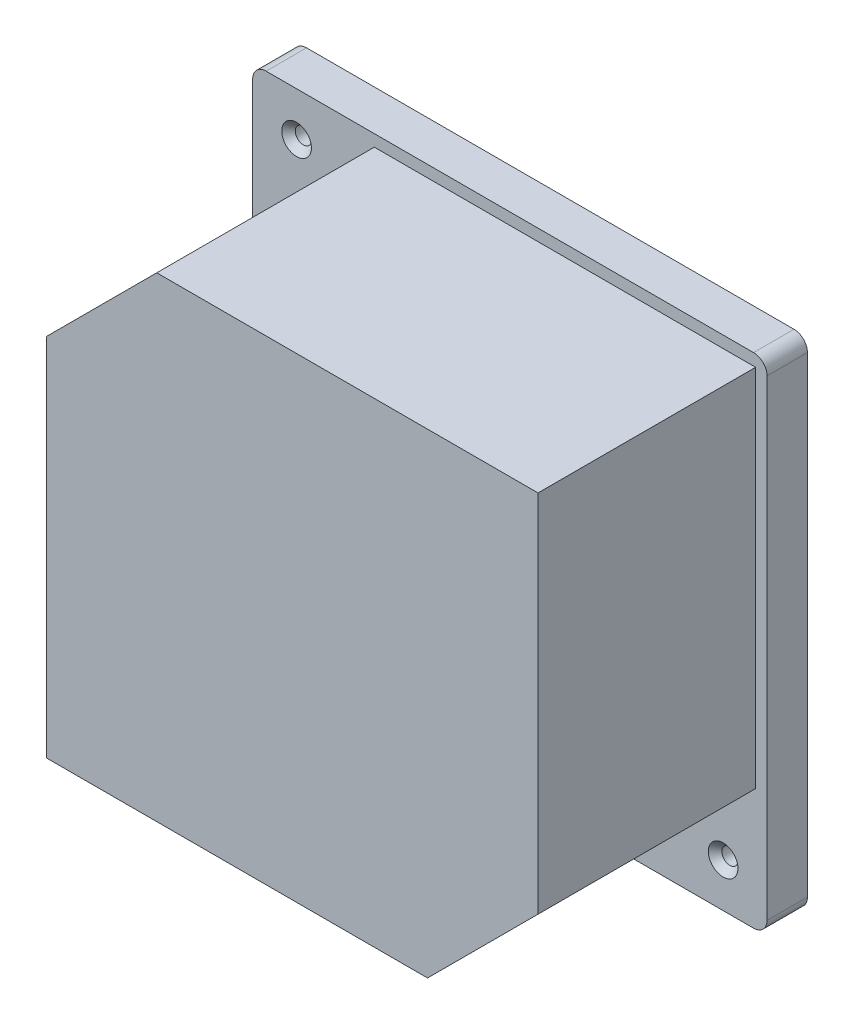
ISO-10303-21;
HEADER;
FILE_DESCRIPTION(('STEP AP214'),'2;1');
FILE_NAME('part.step','',(''),(''),'','','');
FILE_SCHEMA(('AUTOMOTIVE_DESIGN { 1 0 10303 214 1 1 1 1 }'));
ENDSEC;
DATA;
#1=APPLICATION_CONTEXT('core data for automotive mechanical design processes');
#2=APPLICATION_PROTOCOL_DEFINITION('international standard','automotive_design',2000,#1);
#3=PRODUCT_CONTEXT('',#1,'mechanical');
#4=PRODUCT('Part','Part','',(#3));
#5=PRODUCT_RELATED_PRODUCT_CATEGORY('part','',(#4));
#6=PRODUCT_DEFINITION_FORMATION('','',#4);
#7=PRODUCT_DEFINITION_CONTEXT('part definition',#1,'design');
#8=PRODUCT_DEFINITION('design','',#6,#7);
#9=PRODUCT_DEFINITION_SHAPE('','',#8);
#10=(LENGTH_UNIT() NAMED_UNIT(*) SI_UNIT(.MILLI.,.METRE.));
#11=(NAMED_UNIT(*) PLANE_ANGLE_UNIT() SI_UNIT($,.RADIAN.));
#12=(NAMED_UNIT(*) SI_UNIT($,.STERADIAN.) SOLID_ANGLE_UNIT());
#13=UNCERTAINTY_MEASURE_WITH_UNIT(LENGTH_MEASURE(1.E-05),#10,'distance_accuracy_value','');
#14=(GEOMETRIC_REPRESENTATION_CONTEXT(3) GLOBAL_UNCERTAINTY_ASSIGNED_CONTEXT((#13)) GLOBAL_UNIT_ASSIGNED_CONTEXT((#10,
#11,#12)) REPRESENTATION_CONTEXT('',''));
#15=CARTESIAN_POINT('',(0.,0.,0.));
#16=DIRECTION('',(0.,0.,1.));
#17=DIRECTION('',(1.,0.,0.));
#18=AXIS2_PLACEMENT_3D('',#15,#16,#17);
#19=CARTESIAN_POINT('',(43.7732437070171,29.4132437070172,6.));
#20=DIRECTION('',(0.,-1.,0.));
#21=DIRECTION('',(1.,0.,0.));
#22=AXIS2_PLACEMENT_3D('',#19,#20,#21);
#23=PLANE('',#22);
#24=DIRECTION('',(-1.,0.,0.));
#25=VECTOR('',#24,1.);
#26=CARTESIAN_POINT('',(43.7732437070171,29.4132437070172,6.));
#27=LINE('',#26,#25);
#28=CARTESIAN_POINT('',(41.7732437070171,29.4132437070172,6.));
#29=VERTEX_POINT('',#28);
#30=CARTESIAN_POINT('',(-30.5867562929829,29.4132437070172,6.));
#31=VERTEX_POINT('',#30);
#32=EDGE_CURVE('E351',#29,#31,#27,.T.);
#33=ORIENTED_EDGE('',*,*,#32,.F.);
#34=DIRECTION('',(0.,0.,-1.));
#35=VECTOR('',#34,1.);
#36=CARTESIAN_POINT('',(41.7732437070171,29.4132437070172,6.));
#37=LINE('',#36,#35);
#38=CARTESIAN_POINT('',(41.7732437070171,29.4132437070172,0.));
#39=VERTEX_POINT('',#38);
#40=EDGE_CURVE('E381',#29,#39,#37,.T.);
#41=ORIENTED_EDGE('',*,*,#40,.T.);
#42=DIRECTION('',(-1.,0.,0.));
#43=VECTOR('',#42,1.);
#44=CARTESIAN_POINT('',(43.7732437070171,29.4132437070172,0.));
#45=LINE('',#44,#43);
#46=CARTESIAN_POINT('',(-30.5867562929829,29.4132437070172,0.));
#47=VERTEX_POINT('',#46);
#48=EDGE_CURVE('E350',#39,#47,#45,.T.);
#49=ORIENTED_EDGE('',*,*,#48,.T.);
#50=DIRECTION('',(0.,0.,-1.));
#51=VECTOR('',#50,1.);
#52=CARTESIAN_POINT('',(-30.5867562929829,29.4132437070172,6.));
#53=LINE('',#52,#51);
#54=EDGE_CURVE('E376',#47,#31,#53,.F.);
#55=ORIENTED_EDGE('',*,*,#54,.T.);
#56=EDGE_LOOP('',(#33,#41,#49,#55));
#57=FACE_BOUND('',#56,.T.);
#58=ADVANCED_FACE('F43',(#57),#23,.F.);
#59=CARTESIAN_POINT('',(-32.5867562929829,29.4132437070172,6.));
#60=DIRECTION('',(1.,0.,0.));
#61=DIRECTION('',(0.,1.,0.));
#62=AXIS2_PLACEMENT_3D('',#59,#60,#61);
#63=PLANE('',#62);
#64=DIRECTION('',(0.,-1.,0.));
#65=VECTOR('',#64,1.);
#66=CARTESIAN_POINT('',(-32.5867562929829,29.4132437070172,0.));
#67=LINE('',#66,#65);
#68=CARTESIAN_POINT('',(-32.5867562929829,27.4132437070172,0.));
#69=VERTEX_POINT('',#68);
#70=CARTESIAN_POINT('',(-32.5867562929829,-42.5867562929828,0.));
#71=VERTEX_POINT('',#70);
#72=EDGE_CURVE('E364',#69,#71,#67,.T.);
#73=ORIENTED_EDGE('',*,*,#72,.T.);
#74=DIRECTION('',(0.,0.,-1.));
#75=VECTOR('',#74,1.);
#76=CARTESIAN_POINT('',(-32.5867562929829,-42.5867562929828,6.));
#77=LINE('',#76,#75);
#78=CARTESIAN_POINT('',(-32.5867562929829,-42.5867562929828,6.));
#79=VERTEX_POINT('',#78);
#80=EDGE_CURVE('E397',#71,#79,#77,.F.);
#81=ORIENTED_EDGE('',*,*,#80,.T.);
#82=DIRECTION('',(0.,-1.,0.));
#83=VECTOR('',#82,1.);
#84=CARTESIAN_POINT('',(-32.5867562929829,29.4132437070172,6.));
#85=LINE('',#84,#83);
#86=CARTESIAN_POINT('',(-32.5867562929829,27.4132437070172,6.));
#87=VERTEX_POINT('',#86);
#88=EDGE_CURVE('E353',#87,#79,#85,.T.);
#89=ORIENTED_EDGE('',*,*,#88,.F.);
#90=DIRECTION('',(0.,0.,-1.));
#91=VECTOR('',#90,1.);
#92=CARTESIAN_POINT('',(-32.5867562929829,27.4132437070172,6.));
#93=LINE('',#92,#91);
#94=EDGE_CURVE('E362',#87,#69,#93,.T.);
#95=ORIENTED_EDGE('',*,*,#94,.T.);
#96=EDGE_LOOP('',(#73,#81,#89,#95));
#97=FACE_BOUND('',#96,.T.);
#98=ADVANCED_FACE('F432',(#97),#63,.F.);
#99=CARTESIAN_POINT('',(-32.5867562929829,-44.5867562929828,6.));
#100=DIRECTION('',(0.,1.,0.));
#101=DIRECTION('',(0.,0.,1.));
#102=AXIS2_PLACEMENT_3D('',#99,#100,#101);
#103=PLANE('',#102);
#104=DIRECTION('',(1.,0.,0.));
#105=VECTOR('',#104,1.);
#106=CARTESIAN_POINT('',(-32.5867562929829,-44.5867562929828,0.));
#107=LINE('',#106,#105);
#108=CARTESIAN_POINT('',(-30.5867562929829,-44.5867562929828,0.));
#109=VERTEX_POINT('',#108);
#110=CARTESIAN_POINT('',(41.7732437070171,-44.5867562929828,0.));
#111=VERTEX_POINT('',#110);
#112=EDGE_CURVE('E367',#109,#111,#107,.T.);
#113=ORIENTED_EDGE('',*,*,#112,.T.);
#114=DIRECTION('',(0.,0.,-1.));
#115=VECTOR('',#114,1.);
#116=CARTESIAN_POINT('',(41.7732437070171,-44.5867562929828,6.));
#117=LINE('',#116,#115);
#118=CARTESIAN_POINT('',(41.7732437070171,-44.5867562929828,6.));
#119=VERTEX_POINT('',#118);
#120=EDGE_CURVE('E406',#111,#119,#117,.F.);
#121=ORIENTED_EDGE('',*,*,#120,.T.);
#122=DIRECTION('',(1.,0.,0.));
#123=VECTOR('',#122,1.);
#124=CARTESIAN_POINT('',(-32.5867562929829,-44.5867562929828,6.));
#125=LINE('',#124,#123);
#126=CARTESIAN_POINT('',(-30.5867562929829,-44.5867562929828,6.));
#127=VERTEX_POINT('',#126);
#128=EDGE_CURVE('E357',#127,#119,#125,.T.);
#129=ORIENTED_EDGE('',*,*,#128,.F.);
#130=DIRECTION('',(0.,0.,-1.));
#131=VECTOR('',#130,1.);
#132=CARTESIAN_POINT('',(-30.5867562929829,-44.5867562929828,6.));
#133=LINE('',#132,#131);
#134=EDGE_CURVE('E392',#127,#109,#133,.T.);
#135=ORIENTED_EDGE('',*,*,#134,.T.);
#136=EDGE_LOOP('',(#113,#121,#129,#135));
#137=FACE_BOUND('',#136,.T.);
#138=ADVANCED_FACE('F438',(#137),#103,.F.);
#139=CARTESIAN_POINT('',(43.7732437070171,-44.5867562929828,6.));
#140=DIRECTION('',(-1.,0.,0.));
#141=DIRECTION('',(0.,-1.,0.));
#142=AXIS2_PLACEMENT_3D('',#139,#140,#141);
#143=PLANE('',#142);
#144=DIRECTION('',(0.,1.,0.));
#145=VECTOR('',#144,1.);
#146=CARTESIAN_POINT('',(43.7732437070171,-44.5867562929828,6.));
#147=LINE('',#146,#145);
#148=CARTESIAN_POINT('',(43.7732437070171,-42.5867562929828,6.));
#149=VERTEX_POINT('',#148);
#150=CARTESIAN_POINT('',(43.7732437070171,27.4132437070172,6.));
#151=VERTEX_POINT('',#150);
#152=EDGE_CURVE('E360',#149,#151,#147,.T.);
#153=ORIENTED_EDGE('',*,*,#152,.F.);
#154=DIRECTION('',(0.,0.,-1.));
#155=VECTOR('',#154,1.);
#156=CARTESIAN_POINT('',(43.7732437070171,-42.5867562929828,6.));
#157=LINE('',#156,#155);
#158=CARTESIAN_POINT('',(43.7732437070171,-42.5867562929828,0.));
#159=VERTEX_POINT('',#158);
#160=EDGE_CURVE('E401',#149,#159,#157,.T.);
#161=ORIENTED_EDGE('',*,*,#160,.T.);
#162=DIRECTION('',(0.,1.,0.));
#163=VECTOR('',#162,1.);
#164=CARTESIAN_POINT('',(43.7732437070171,-44.5867562929828,0.));
#165=LINE('',#164,#163);
#166=CARTESIAN_POINT('',(43.7732437070171,27.4132437070172,0.));
#167=VERTEX_POINT('',#166);
#168=EDGE_CURVE('E354',#159,#167,#165,.T.);
#169=ORIENTED_EDGE('',*,*,#168,.T.);
#170=DIRECTION('',(0.,0.,-1.));
#171=VECTOR('',#170,1.);
#172=CARTESIAN_POINT('',(43.7732437070171,27.4132437070172,6.));
#173=LINE('',#172,#171);
#174=EDGE_CURVE('E387',#167,#151,#173,.F.);
#175=ORIENTED_EDGE('',*,*,#174,.T.);
#176=EDGE_LOOP('',(#153,#161,#169,#175));
#177=FACE_BOUND('',#176,.T.);
#178=ADVANCED_FACE('F474',(#177),#143,.F.);
#179=CARTESIAN_POINT('',(0.,0.,6.));
#180=DIRECTION('',(0.,0.,1.));
#181=DIRECTION('',(1.,0.,0.));
#182=AXIS2_PLACEMENT_3D('',#179,#180,#181);
#183=PLANE('',#182);
#184=DIRECTION('',(-0.707106781186548,-0.707106781186548,0.));
#185=VECTOR('',#184,1.);
#186=CARTESIAN_POINT('',(-21.1000000000001,21.1000000000001,6.));
#187=LINE('',#186,#185);
#188=CARTESIAN_POINT('',(-14.5267562929829,27.6732437070172,6.));
#189=VERTEX_POINT('',#188);
#190=CARTESIAN_POINT('',(-30.8867562929829,11.3132437070172,6.));
#191=VERTEX_POINT('',#190);
#192=EDGE_CURVE('E329',#189,#191,#187,.T.);
#193=ORIENTED_EDGE('',*,*,#192,.F.);
#194=DIRECTION('',(-1.,0.,0.));
#195=VECTOR('',#194,1.);
#196=CARTESIAN_POINT('',(0.,27.6732437070172,6.));
#197=LINE('',#196,#195);
#198=CARTESIAN_POINT('',(42.0732437070171,27.6732437070172,6.));
#199=VERTEX_POINT('',#198);
#200=EDGE_CURVE('E315',#199,#189,#197,.T.);
#201=ORIENTED_EDGE('',*,*,#200,.F.);
#202=DIRECTION('',(0.,1.,0.));
#203=VECTOR('',#202,1.);
#204=CARTESIAN_POINT('',(42.0732437070171,0.,6.));
#205=LINE('',#204,#203);
#206=CARTESIAN_POINT('',(42.0732437070171,-26.4889285983595,6.));
#207=VERTEX_POINT('',#206);
#208=EDGE_CURVE('E318',#207,#199,#205,.T.);
#209=ORIENTED_EDGE('',*,*,#208,.F.);
#210=DIRECTION('',(0.707106781186546,0.707106781186549,0.));
#211=VECTOR('',#210,1.);
#212=CARTESIAN_POINT('',(34.2810861526884,-34.2810861526883,6.));
#213=LINE('',#212,#211);
#214=CARTESIAN_POINT('',(25.6754160123939,-42.8867562929828,6.));
#215=VERTEX_POINT('',#214);
#216=EDGE_CURVE('E321',#215,#207,#213,.T.);
#217=ORIENTED_EDGE('',*,*,#216,.F.);
#218=DIRECTION('',(1.,0.,0.));
#219=VECTOR('',#218,1.);
#220=CARTESIAN_POINT('',(0.,-42.8867562929828,6.));
#221=LINE('',#220,#219);
#222=CARTESIAN_POINT('',(-30.8867562929829,-42.8867562929828,6.));
#223=VERTEX_POINT('',#222);
#224=EDGE_CURVE('E324',#223,#215,#221,.T.);
#225=ORIENTED_EDGE('',*,*,#224,.F.);
#226=DIRECTION('',(0.,1.,0.));
#227=VECTOR('',#226,1.);
#228=CARTESIAN_POINT('',(-30.8867562929829,0.,6.));
#229=LINE('',#228,#227);
#230=EDGE_CURVE('E327',#223,#191,#229,.T.);
#231=ORIENTED_EDGE('',*,*,#230,.T.);
#232=EDGE_LOOP('',(#193,#201,#209,#217,#225,#231));
#233=FACE_BOUND('',#232,.T.);
#234=CARTESIAN_POINT('',(-26.0666971211263,22.8932437070172,6.));
#235=DIRECTION('',(0.,0.,1.));
#236=DIRECTION('',(1.,0.,0.));
#237=AXIS2_PLACEMENT_3D('',#234,#235,#236);
#238=CIRCLE('',#237,2.2);
#239=CARTESIAN_POINT('',(-23.8666971211263,22.8932437070172,6.));
#240=VERTEX_POINT('',#239);
#241=EDGE_CURVE('E332',#240,#240,#238,.T.);
#242=ORIENTED_EDGE('',*,*,#241,.F.);
#243=EDGE_LOOP('',(#242));
#244=FACE_BOUND('',#243,.T.);
#245=CARTESIAN_POINT('',(37.2554160123939,-38.0666971211262,6.));
#246=DIRECTION('',(0.,0.,1.));
#247=DIRECTION('',(1.,0.,0.));
#248=AXIS2_PLACEMENT_3D('',#245,#246,#247);
#249=CIRCLE('',#248,2.2);
#250=CARTESIAN_POINT('',(39.4554160123939,-38.0666971211262,6.));
#251=VERTEX_POINT('',#250);
#252=EDGE_CURVE('E341',#251,#251,#249,.T.);
#253=ORIENTED_EDGE('',*,*,#252,.F.);
#254=EDGE_LOOP('',(#253));
#255=FACE_BOUND('',#254,.T.);
#256=ORIENTED_EDGE('',*,*,#128,.T.);
#257=CARTESIAN_POINT('',(41.7732437070171,-42.5867562929828,6.));
#258=DIRECTION('',(0.,0.,1.));
#259=DIRECTION('',(1.,0.,0.));
#260=AXIS2_PLACEMENT_3D('',#257,#258,#259);
#261=CIRCLE('',#260,2.);
#262=EDGE_CURVE('E408',#119,#149,#261,.T.);
#263=ORIENTED_EDGE('',*,*,#262,.T.);
#264=ORIENTED_EDGE('',*,*,#152,.T.);
#265=CARTESIAN_POINT('',(41.7732437070171,27.4132437070172,6.));
#266=DIRECTION('',(0.,0.,1.));
#267=DIRECTION('',(1.,0.,0.));
#268=AXIS2_PLACEMENT_3D('',#265,#266,#267);
#269=CIRCLE('',#268,2.);
#270=EDGE_CURVE('E390',#151,#29,#269,.T.);
#271=ORIENTED_EDGE('',*,*,#270,.T.);
#272=ORIENTED_EDGE('',*,*,#32,.T.);
#273=CARTESIAN_POINT('',(-30.5867562929829,27.4132437070172,6.));
#274=DIRECTION('',(0.,0.,1.));
#275=DIRECTION('',(1.,0.,0.));
#276=AXIS2_PLACEMENT_3D('',#273,#274,#275);
#277=CIRCLE('',#276,2.);
#278=EDGE_CURVE('E379',#31,#87,#277,.T.);
#279=ORIENTED_EDGE('',*,*,#278,.T.);
#280=ORIENTED_EDGE('',*,*,#88,.T.);
#281=CARTESIAN_POINT('',(-30.5867562929829,-42.5867562929828,6.));
#282=DIRECTION('',(0.,0.,1.));
#283=DIRECTION('',(1.,0.,0.));
#284=AXIS2_PLACEMENT_3D('',#281,#282,#283);
#285=CIRCLE('',#284,2.);
#286=EDGE_CURVE('E399',#79,#127,#285,.T.);
#287=ORIENTED_EDGE('',*,*,#286,.T.);
#288=EDGE_LOOP('',(#256,#263,#264,#271,#272,#279,#280,#287));
#289=FACE_BOUND('',#288,.T.);
#290=ADVANCED_FACE('F465',(#233,#244,#255,#289),#183,.T.);
#291=CARTESIAN_POINT('',(0.,0.,0.));
#292=DIRECTION('',(0.,0.,1.));
#293=DIRECTION('',(1.,0.,0.));
#294=AXIS2_PLACEMENT_3D('',#291,#292,#293);
#295=PLANE('',#294);
#296=DIRECTION('',(-1.,0.,0.));
#297=VECTOR('',#296,1.);
#298=CARTESIAN_POINT('',(25.1686050519443,-40.7867562929828,0.));
#299=LINE('',#298,#297);
#300=CARTESIAN_POINT('',(25.1686050519443,-40.7867562929828,0.));
#301=VERTEX_POINT('',#300);
#302=CARTESIAN_POINT('',(-28.7867562929829,-40.7867562929828,0.));
#303=VERTEX_POINT('',#302);
#304=EDGE_CURVE('E254',#301,#303,#299,.T.);
#305=ORIENTED_EDGE('',*,*,#304,.F.);
#306=DIRECTION('',(-0.710435525812495,-0.703762292015936,0.));
#307=VECTOR('',#306,1.);
#308=CARTESIAN_POINT('',(39.9754160123939,-26.119028060987,0.));
#309=LINE('',#308,#307);
#310=CARTESIAN_POINT('',(39.9754160123939,-26.119028060987,0.));
#311=VERTEX_POINT('',#310);
#312=EDGE_CURVE('E230',#311,#301,#309,.T.);
#313=ORIENTED_EDGE('',*,*,#312,.F.);
#314=DIRECTION('',(0.00355189987590054,-0.99999369198374,0.));
#315=VECTOR('',#314,1.);
#316=CARTESIAN_POINT('',(39.7916670036293,25.6132437070172,0.));
#317=LINE('',#316,#315);
#318=CARTESIAN_POINT('',(39.7916670036293,25.6132437070172,0.));
#319=VERTEX_POINT('',#318);
#320=EDGE_CURVE('E237',#319,#311,#317,.T.);
#321=ORIENTED_EDGE('',*,*,#320,.F.);
#322=DIRECTION('',(1.,0.,0.));
#323=VECTOR('',#322,1.);
#324=CARTESIAN_POINT('',(-13.3866503043968,25.6132437070172,0.));
#325=LINE('',#324,#323);
#326=CARTESIAN_POINT('',(-13.3866503043968,25.6132437070172,0.));
#327=VERTEX_POINT('',#326);
#328=EDGE_CURVE('E263',#327,#319,#325,.T.);
#329=ORIENTED_EDGE('',*,*,#328,.F.);
#330=DIRECTION('',(0.713531384787131,0.700623267472441,0.));
#331=VECTOR('',#330,1.);
#332=CARTESIAN_POINT('',(-28.7867562929829,10.4917328566374,0.));
#333=LINE('',#332,#331);
#334=CARTESIAN_POINT('',(-28.7867562929829,10.4917328566374,0.));
#335=VERTEX_POINT('',#334);
#336=EDGE_CURVE('E260',#335,#327,#333,.T.);
#337=ORIENTED_EDGE('',*,*,#336,.F.);
#338=DIRECTION('',(0.,1.,0.));
#339=VECTOR('',#338,1.);
#340=CARTESIAN_POINT('',(-28.7867562929829,-40.7867562929828,0.));
#341=LINE('',#340,#339);
#342=EDGE_CURVE('E257',#303,#335,#341,.T.);
#343=ORIENTED_EDGE('',*,*,#342,.F.);
#344=EDGE_LOOP('',(#305,#313,#321,#329,#337,#343));
#345=FACE_BOUND('',#344,.T.);
#346=CARTESIAN_POINT('',(-26.0666971211263,22.8932437070172,0.));
#347=DIRECTION('',(0.,0.,1.));
#348=DIRECTION('',(1.,0.,0.));
#349=AXIS2_PLACEMENT_3D('',#346,#347,#348);
#350=CIRCLE('',#349,1.19999999999999);
#351=CARTESIAN_POINT('',(-24.8666971211263,22.8932437070172,0.));
#352=VERTEX_POINT('',#351);
#353=EDGE_CURVE('E338',#352,#352,#350,.T.);
#354=ORIENTED_EDGE('',*,*,#353,.T.);
#355=EDGE_LOOP('',(#354));
#356=FACE_BOUND('',#355,.T.);
#357=CARTESIAN_POINT('',(37.2554160123939,-38.0666971211262,0.));
#358=DIRECTION('',(0.,0.,1.));
#359=DIRECTION('',(1.,0.,0.));
#360=AXIS2_PLACEMENT_3D('',#357,#358,#359);
#361=CIRCLE('',#360,1.19999999999999);
#362=CARTESIAN_POINT('',(38.4554160123938,-38.0666971211262,0.));
#363=VERTEX_POINT('',#362);
#364=EDGE_CURVE('E347',#363,#363,#361,.T.);
#365=ORIENTED_EDGE('',*,*,#364,.T.);
#366=EDGE_LOOP('',(#365));
#367=FACE_BOUND('',#366,.T.);
#368=ORIENTED_EDGE('',*,*,#168,.F.);
#369=CARTESIAN_POINT('',(41.7732437070171,-42.5867562929828,0.));
#370=DIRECTION('',(0.,0.,1.));
#371=DIRECTION('',(1.,0.,0.));
#372=AXIS2_PLACEMENT_3D('',#369,#370,#371);
#373=CIRCLE('',#372,2.);
#374=EDGE_CURVE('E404',#159,#111,#373,.F.);
#375=ORIENTED_EDGE('',*,*,#374,.T.);
#376=ORIENTED_EDGE('',*,*,#112,.F.);
#377=CARTESIAN_POINT('',(-30.5867562929829,-42.5867562929828,0.));
#378=DIRECTION('',(0.,0.,1.));
#379=DIRECTION('',(1.,0.,0.));
#380=AXIS2_PLACEMENT_3D('',#377,#378,#379);
#381=CIRCLE('',#380,2.);
#382=EDGE_CURVE('E395',#109,#71,#381,.F.);
#383=ORIENTED_EDGE('',*,*,#382,.T.);
#384=ORIENTED_EDGE('',*,*,#72,.F.);
#385=CARTESIAN_POINT('',(-30.5867562929829,27.4132437070172,0.));
#386=DIRECTION('',(0.,0.,1.));
#387=DIRECTION('',(1.,0.,0.));
#388=AXIS2_PLACEMENT_3D('',#385,#386,#387);
#389=CIRCLE('',#388,2.);
#390=EDGE_CURVE('E373',#69,#47,#389,.F.);
#391=ORIENTED_EDGE('',*,*,#390,.T.);
#392=ORIENTED_EDGE('',*,*,#48,.F.);
#393=CARTESIAN_POINT('',(41.7732437070171,27.4132437070172,0.));
#394=DIRECTION('',(0.,0.,1.));
#395=DIRECTION('',(1.,0.,0.));
#396=AXIS2_PLACEMENT_3D('',#393,#394,#395);
#397=CIRCLE('',#396,2.);
#398=EDGE_CURVE('E384',#39,#167,#397,.F.);
#399=ORIENTED_EDGE('',*,*,#398,.T.);
#400=EDGE_LOOP('',(#368,#375,#376,#383,#384,#391,#392,#399));
#401=FACE_BOUND('',#400,.T.);
#402=ADVANCED_FACE('F448',(#345,#356,#367,#401),#295,.F.);
#403=CARTESIAN_POINT('',(-30.5867562929829,27.4132437070172,6.));
#404=DIRECTION('',(0.,0.,-1.));
#405=DIRECTION('',(-1.,0.,0.));
#406=AXIS2_PLACEMENT_3D('',#403,#404,#405);
#407=CYLINDRICAL_SURFACE('',#406,2.);
#408=ORIENTED_EDGE('',*,*,#278,.F.);
#409=ORIENTED_EDGE('',*,*,#54,.F.);
#410=ORIENTED_EDGE('',*,*,#390,.F.);
#411=ORIENTED_EDGE('',*,*,#94,.F.);
#412=EDGE_LOOP('',(#408,#409,#410,#411));
#413=FACE_BOUND('',#412,.T.);
#414=ADVANCED_FACE('F444',(#413),#407,.T.);
#415=CARTESIAN_POINT('',(41.7732437070171,27.4132437070172,6.));
#416=DIRECTION('',(0.,0.,-1.));
#417=DIRECTION('',(-1.,0.,0.));
#418=AXIS2_PLACEMENT_3D('',#415,#416,#417);
#419=CYLINDRICAL_SURFACE('',#418,2.);
#420=ORIENTED_EDGE('',*,*,#270,.F.);
#421=ORIENTED_EDGE('',*,*,#174,.F.);
#422=ORIENTED_EDGE('',*,*,#398,.F.);
#423=ORIENTED_EDGE('',*,*,#40,.F.);
#424=EDGE_LOOP('',(#420,#421,#422,#423));
#425=FACE_BOUND('',#424,.T.);
#426=ADVANCED_FACE('F447',(#425),#419,.T.);
#427=CARTESIAN_POINT('',(-30.5867562929829,-42.5867562929828,6.));
#428=DIRECTION('',(0.,0.,-1.));
#429=DIRECTION('',(-1.,0.,0.));
#430=AXIS2_PLACEMENT_3D('',#427,#428,#429);
#431=CYLINDRICAL_SURFACE('',#430,2.);
#432=ORIENTED_EDGE('',*,*,#286,.F.);
#433=ORIENTED_EDGE('',*,*,#80,.F.);
#434=ORIENTED_EDGE('',*,*,#382,.F.);
#435=ORIENTED_EDGE('',*,*,#134,.F.);
#436=EDGE_LOOP('',(#432,#433,#434,#435));
#437=FACE_BOUND('',#436,.T.);
#438=ADVANCED_FACE('F451',(#437),#431,.T.);
#439=CARTESIAN_POINT('',(41.7732437070171,-42.5867562929828,6.));
#440=DIRECTION('',(0.,0.,-1.));
#441=DIRECTION('',(-1.,0.,0.));
#442=AXIS2_PLACEMENT_3D('',#439,#440,#441);
#443=CYLINDRICAL_SURFACE('',#442,2.);
#444=ORIENTED_EDGE('',*,*,#262,.F.);
#445=ORIENTED_EDGE('',*,*,#120,.F.);
#446=ORIENTED_EDGE('',*,*,#374,.F.);
#447=ORIENTED_EDGE('',*,*,#160,.F.);
#448=EDGE_LOOP('',(#444,#445,#446,#447));
#449=FACE_BOUND('',#448,.T.);
#450=ADVANCED_FACE('F45',(#449),#443,.T.);
#451=CARTESIAN_POINT('',(37.2554160123939,-38.0666971211262,6.));
#452=DIRECTION('',(0.,0.,1.));
#453=DIRECTION('',(1.,0.,0.));
#454=AXIS2_PLACEMENT_3D('',#451,#452,#453);
#455=CYLINDRICAL_SURFACE('',#454,1.19999999999999);
#456=ORIENTED_EDGE('',*,*,#364,.F.);
#457=EDGE_LOOP('',(#456));
#458=FACE_BOUND('',#457,.T.);
#459=CARTESIAN_POINT('',(37.2554160123939,-38.0666971211262,5.));
#460=DIRECTION('',(0.,0.,1.));
#461=DIRECTION('',(1.,0.,0.));
#462=AXIS2_PLACEMENT_3D('',#459,#460,#461);
#463=CIRCLE('',#462,1.19999999999999);
#464=CARTESIAN_POINT('',(38.4554160123938,-38.0666971211262,5.));
#465=VERTEX_POINT('',#464);
#466=EDGE_CURVE('E344',#465,#465,#463,.T.);
#467=ORIENTED_EDGE('',*,*,#466,.T.);
#468=EDGE_LOOP('',(#467));
#469=FACE_BOUND('',#468,.T.);
#470=ADVANCED_FACE('F458',(#458,#469),#455,.F.);
#471=CARTESIAN_POINT('',(37.2554160123939,-38.0666971211262,6.));
#472=DIRECTION('',(0.,0.,1.));
#473=DIRECTION('',(1.,0.,0.));
#474=AXIS2_PLACEMENT_3D('',#471,#472,#473);
#475=CONICAL_SURFACE('',#474,2.2,0.785398163397454);
#476=ORIENTED_EDGE('',*,*,#466,.F.);
#477=EDGE_LOOP('',(#476));
#478=FACE_BOUND('',#477,.T.);
#479=ORIENTED_EDGE('',*,*,#252,.T.);
#480=EDGE_LOOP('',(#479));
#481=FACE_BOUND('',#480,.T.);
#482=ADVANCED_FACE('F737',(#478,#481),#475,.F.);
#483=CARTESIAN_POINT('',(-26.0666971211263,22.8932437070172,6.));
#484=DIRECTION('',(0.,0.,1.));
#485=DIRECTION('',(1.,0.,0.));
#486=AXIS2_PLACEMENT_3D('',#483,#484,#485);
#487=CYLINDRICAL_SURFACE('',#486,1.19999999999999);
#488=ORIENTED_EDGE('',*,*,#353,.F.);
#489=EDGE_LOOP('',(#488));
#490=FACE_BOUND('',#489,.T.);
#491=CARTESIAN_POINT('',(-26.0666971211263,22.8932437070172,5.));
#492=DIRECTION('',(0.,0.,1.));
#493=DIRECTION('',(1.,0.,0.));
#494=AXIS2_PLACEMENT_3D('',#491,#492,#493);
#495=CIRCLE('',#494,1.19999999999999);
#496=CARTESIAN_POINT('',(-24.8666971211263,22.8932437070172,5.));
#497=VERTEX_POINT('',#496);
#498=EDGE_CURVE('E335',#497,#497,#495,.T.);
#499=ORIENTED_EDGE('',*,*,#498,.T.);
#500=EDGE_LOOP('',(#499));
#501=FACE_BOUND('',#500,.T.);
#502=ADVANCED_FACE('F728',(#490,#501),#487,.F.);
#503=CARTESIAN_POINT('',(-26.0666971211263,22.8932437070172,6.));
#504=DIRECTION('',(0.,0.,1.));
#505=DIRECTION('',(1.,0.,0.));
#506=AXIS2_PLACEMENT_3D('',#503,#504,#505);
#507=CONICAL_SURFACE('',#506,2.2,0.785398163397454);
#508=ORIENTED_EDGE('',*,*,#498,.F.);
#509=EDGE_LOOP('',(#508));
#510=FACE_BOUND('',#509,.T.);
#511=ORIENTED_EDGE('',*,*,#241,.T.);
#512=EDGE_LOOP('',(#511));
#513=FACE_BOUND('',#512,.T.);
#514=ADVANCED_FACE('F520',(#510,#513),#507,.F.);
#515=CARTESIAN_POINT('',(-21.1000000000001,21.1000000000001,38.3));
#516=DIRECTION('',(-0.707106781186548,0.707106781186548,0.));
#517=DIRECTION('',(-0.707106781186548,-0.707106781186548,0.));
#518=AXIS2_PLACEMENT_3D('',#515,#516,#517);
#519=PLANE('',#518);
#520=DIRECTION('',(0.,0.,-1.));
#521=VECTOR('',#520,1.);
#522=CARTESIAN_POINT('',(-14.5267562929829,27.6732437070172,38.3));
#523=LINE('',#522,#521);
#524=CARTESIAN_POINT('',(-14.5267562929829,27.6732437070172,38.3));
#525=VERTEX_POINT('',#524);
#526=EDGE_CURVE('E297',#525,#189,#523,.T.);
#527=ORIENTED_EDGE('',*,*,#526,.T.);
#528=ORIENTED_EDGE('',*,*,#192,.T.);
#529=DIRECTION('',(0.,0.,-1.));
#530=VECTOR('',#529,1.);
#531=CARTESIAN_POINT('',(-30.8867562929829,11.3132437070172,38.3));
#532=LINE('',#531,#530);
#533=CARTESIAN_POINT('',(-30.8867562929829,11.3132437070172,38.3));
#534=VERTEX_POINT('',#533);
#535=EDGE_CURVE('E312',#534,#191,#532,.T.);
#536=ORIENTED_EDGE('',*,*,#535,.F.);
#537=DIRECTION('',(0.707106781186548,0.707106781186548,0.));
#538=VECTOR('',#537,1.);
#539=CARTESIAN_POINT('',(-21.1000000000001,21.1000000000001,38.3));
#540=LINE('',#539,#538);
#541=EDGE_CURVE('E270',#534,#525,#540,.T.);
#542=ORIENTED_EDGE('',*,*,#541,.T.);
#543=EDGE_LOOP('',(#527,#528,#536,#542));
#544=FACE_BOUND('',#543,.T.);
#545=ADVANCED_FACE('F525',(#544),#519,.T.);
#546=CARTESIAN_POINT('',(-30.8867562929829,0.,38.3));
#547=DIRECTION('',(1.,0.,0.));
#548=DIRECTION('',(0.,1.,0.));
#549=AXIS2_PLACEMENT_3D('',#546,#547,#548);
#550=PLANE('',#549);
#551=ORIENTED_EDGE('',*,*,#230,.F.);
#552=DIRECTION('',(0.,0.,-1.));
#553=VECTOR('',#552,1.);
#554=CARTESIAN_POINT('',(-30.8867562929829,-42.8867562929828,38.3));
#555=LINE('',#554,#553);
#556=CARTESIAN_POINT('',(-30.8867562929829,-42.8867562929828,38.3));
#557=VERTEX_POINT('',#556);
#558=EDGE_CURVE('E309',#557,#223,#555,.T.);
#559=ORIENTED_EDGE('',*,*,#558,.F.);
#560=DIRECTION('',(0.,-1.,0.));
#561=VECTOR('',#560,1.);
#562=CARTESIAN_POINT('',(-30.8867562929829,0.,38.3));
#563=LINE('',#562,#561);
#564=EDGE_CURVE('E283',#534,#557,#563,.T.);
#565=ORIENTED_EDGE('',*,*,#564,.F.);
#566=ORIENTED_EDGE('',*,*,#535,.T.);
#567=EDGE_LOOP('',(#551,#559,#565,#566));
#568=FACE_BOUND('',#567,.T.);
#569=ADVANCED_FACE('F530',(#568),#550,.F.);
#570=CARTESIAN_POINT('',(0.,-42.8867562929828,38.3));
#571=DIRECTION('',(0.,-1.,0.));
#572=DIRECTION('',(1.,0.,0.));
#573=AXIS2_PLACEMENT_3D('',#570,#571,#572);
#574=PLANE('',#573);
#575=DIRECTION('',(0.,0.,1.));
#576=VECTOR('',#575,1.);
#577=CARTESIAN_POINT('',(12.95,-42.8867562929828,32.8));
#578=LINE('',#577,#576);
#579=CARTESIAN_POINT('',(12.95,-42.8867562929828,11.2));
#580=VERTEX_POINT('',#579);
#581=CARTESIAN_POINT('',(12.95,-42.8867562929828,32.8));
#582=VERTEX_POINT('',#581);
#583=EDGE_CURVE('E58',#580,#582,#578,.T.);
#584=ORIENTED_EDGE('',*,*,#583,.F.);
#585=DIRECTION('',(1.,0.,0.));
#586=VECTOR('',#585,1.);
#587=CARTESIAN_POINT('',(-24.95,-42.8867562929828,11.2));
#588=LINE('',#587,#586);
#589=CARTESIAN_POINT('',(-24.95,-42.8867562929828,11.2));
#590=VERTEX_POINT('',#589);
#591=EDGE_CURVE('E223',#590,#580,#588,.T.);
#592=ORIENTED_EDGE('',*,*,#591,.F.);
#593=DIRECTION('',(0.,0.,-1.));
#594=VECTOR('',#593,1.);
#595=CARTESIAN_POINT('',(-24.95,-42.8867562929828,32.8));
#596=LINE('',#595,#594);
#597=CARTESIAN_POINT('',(-24.95,-42.8867562929828,32.8));
#598=VERTEX_POINT('',#597);
#599=EDGE_CURVE('E207',#598,#590,#596,.T.);
#600=ORIENTED_EDGE('',*,*,#599,.F.);
#601=DIRECTION('',(-1.,0.,0.));
#602=VECTOR('',#601,1.);
#603=CARTESIAN_POINT('',(-24.95,-42.8867562929828,32.8));
#604=LINE('',#603,#602);
#605=EDGE_CURVE('E216',#582,#598,#604,.T.);
#606=ORIENTED_EDGE('',*,*,#605,.F.);
#607=EDGE_LOOP('',(#584,#592,#600,#606));
#608=FACE_BOUND('',#607,.T.);
#609=ORIENTED_EDGE('',*,*,#558,.T.);
#610=ORIENTED_EDGE('',*,*,#224,.T.);
#611=DIRECTION('',(0.,0.,-1.));
#612=VECTOR('',#611,1.);
#613=CARTESIAN_POINT('',(25.6754160123939,-42.8867562929828,38.3));
#614=LINE('',#613,#612);
#615=CARTESIAN_POINT('',(25.6754160123939,-42.8867562929828,38.3));
#616=VERTEX_POINT('',#615);
#617=EDGE_CURVE('E306',#616,#215,#614,.T.);
#618=ORIENTED_EDGE('',*,*,#617,.F.);
#619=DIRECTION('',(-1.,0.,0.));
#620=VECTOR('',#619,1.);
#621=CARTESIAN_POINT('',(0.,-42.8867562929828,38.3));
#622=LINE('',#621,#620);
#623=EDGE_CURVE('E285',#616,#557,#622,.T.);
#624=ORIENTED_EDGE('',*,*,#623,.T.);
#625=EDGE_LOOP('',(#609,#610,#618,#624));
#626=FACE_BOUND('',#625,.T.);
#627=ADVANCED_FACE('F220',(#608,#626),#574,.T.);
#628=CARTESIAN_POINT('',(34.2810861526884,-34.2810861526883,38.3));
#629=DIRECTION('',(0.707106781186549,-0.707106781186546,0.));
#630=DIRECTION('',(0.707106781186546,0.707106781186549,0.));
#631=AXIS2_PLACEMENT_3D('',#628,#629,#630);
#632=PLANE('',#631);
#633=ORIENTED_EDGE('',*,*,#617,.T.);
#634=ORIENTED_EDGE('',*,*,#216,.T.);
#635=DIRECTION('',(0.,0.,-1.));
#636=VECTOR('',#635,1.);
#637=CARTESIAN_POINT('',(42.0732437070171,-26.4889285983595,38.3));
#638=LINE('',#637,#636);
#639=CARTESIAN_POINT('',(42.0732437070171,-26.4889285983595,38.3));
#640=VERTEX_POINT('',#639);
#641=EDGE_CURVE('E303',#640,#207,#638,.T.);
#642=ORIENTED_EDGE('',*,*,#641,.F.);
#643=DIRECTION('',(-0.707106781186546,-0.707106781186549,0.));
#644=VECTOR('',#643,1.);
#645=CARTESIAN_POINT('',(34.2810861526884,-34.2810861526883,38.3));
#646=LINE('',#645,#644);
#647=EDGE_CURVE('E288',#640,#616,#646,.T.);
#648=ORIENTED_EDGE('',*,*,#647,.T.);
#649=EDGE_LOOP('',(#633,#634,#642,#648));
#650=FACE_BOUND('',#649,.T.);
#651=ADVANCED_FACE('F549',(#650),#632,.T.);
#652=CARTESIAN_POINT('',(42.0732437070171,0.,38.3));
#653=DIRECTION('',(1.,0.,0.));
#654=DIRECTION('',(0.,0.,-1.));
#655=AXIS2_PLACEMENT_3D('',#652,#653,#654);
#656=PLANE('',#655);
#657=ORIENTED_EDGE('',*,*,#641,.T.);
#658=ORIENTED_EDGE('',*,*,#208,.T.);
#659=DIRECTION('',(0.,0.,-1.));
#660=VECTOR('',#659,1.);
#661=CARTESIAN_POINT('',(42.0732437070171,27.6732437070172,38.3));
#662=LINE('',#661,#660);
#663=CARTESIAN_POINT('',(42.0732437070171,27.6732437070172,38.3));
#664=VERTEX_POINT('',#663);
#665=EDGE_CURVE('E300',#664,#199,#662,.T.);
#666=ORIENTED_EDGE('',*,*,#665,.F.);
#667=DIRECTION('',(0.,-1.,0.));
#668=VECTOR('',#667,1.);
#669=CARTESIAN_POINT('',(42.0732437070171,0.,38.3));
#670=LINE('',#669,#668);
#671=EDGE_CURVE('E291',#664,#640,#670,.T.);
#672=ORIENTED_EDGE('',*,*,#671,.T.);
#673=EDGE_LOOP('',(#657,#658,#666,#672));
#674=FACE_BOUND('',#673,.T.);
#675=ADVANCED_FACE('F554',(#674),#656,.T.);
#676=CARTESIAN_POINT('',(0.,27.6732437070172,38.3));
#677=DIRECTION('',(0.,1.,0.));
#678=DIRECTION('',(0.,0.,1.));
#679=AXIS2_PLACEMENT_3D('',#676,#677,#678);
#680=PLANE('',#679);
#681=ORIENTED_EDGE('',*,*,#665,.T.);
#682=ORIENTED_EDGE('',*,*,#200,.T.);
#683=ORIENTED_EDGE('',*,*,#526,.F.);
#684=DIRECTION('',(1.,0.,0.));
#685=VECTOR('',#684,1.);
#686=CARTESIAN_POINT('',(0.,27.6732437070172,38.3));
#687=LINE('',#686,#685);
#688=EDGE_CURVE('E294',#525,#664,#687,.T.);
#689=ORIENTED_EDGE('',*,*,#688,.T.);
#690=EDGE_LOOP('',(#681,#682,#683,#689));
#691=FACE_BOUND('',#690,.T.);
#692=ADVANCED_FACE('F566',(#691),#680,.T.);
#693=CARTESIAN_POINT('',(0.,0.,38.3));
#694=DIRECTION('',(0.,0.,1.));
#695=DIRECTION('',(1.,0.,0.));
#696=AXIS2_PLACEMENT_3D('',#693,#694,#695);
#697=PLANE('',#696);
#698=ORIENTED_EDGE('',*,*,#541,.F.);
#699=ORIENTED_EDGE('',*,*,#564,.T.);
#700=ORIENTED_EDGE('',*,*,#623,.F.);
#701=ORIENTED_EDGE('',*,*,#647,.F.);
#702=ORIENTED_EDGE('',*,*,#671,.F.);
#703=ORIENTED_EDGE('',*,*,#688,.F.);
#704=EDGE_LOOP('',(#698,#699,#700,#701,#702,#703));
#705=FACE_BOUND('',#704,.T.);
#706=ADVANCED_FACE('F577',(#705),#697,.T.);
#707=CARTESIAN_POINT('',(39.9754160123939,-26.119028060987,36.3));
#708=DIRECTION('',(0.703762292015936,-0.710435525812495,0.));
#709=DIRECTION('',(0.710435525812495,0.703762292015937,0.));
#710=AXIS2_PLACEMENT_3D('',#707,#708,#709);
#711=PLANE('',#710);
#712=ORIENTED_EDGE('',*,*,#312,.T.);
#713=DIRECTION('',(0.,0.,-1.));
#714=VECTOR('',#713,1.);
#715=CARTESIAN_POINT('',(25.1686050519443,-40.7867562929828,36.3));
#716=LINE('',#715,#714);
#717=CARTESIAN_POINT('',(25.1686050519443,-40.7867562929828,36.3));
#718=VERTEX_POINT('',#717);
#719=EDGE_CURVE('E252',#718,#301,#716,.T.);
#720=ORIENTED_EDGE('',*,*,#719,.F.);
#721=DIRECTION('',(-0.710435525812495,-0.703762292015936,0.));
#722=VECTOR('',#721,1.);
#723=CARTESIAN_POINT('',(39.9754160123939,-26.119028060987,36.3));
#724=LINE('',#723,#722);
#725=CARTESIAN_POINT('',(39.9754160123939,-26.119028060987,36.3));
#726=VERTEX_POINT('',#725);
#727=EDGE_CURVE('E233',#726,#718,#724,.T.);
#728=ORIENTED_EDGE('',*,*,#727,.F.);
#729=DIRECTION('',(0.,0.,-1.));
#730=VECTOR('',#729,1.);
#731=CARTESIAN_POINT('',(39.9754160123939,-26.119028060987,36.3));
#732=LINE('',#731,#730);
#733=EDGE_CURVE('E268',#726,#311,#732,.T.);
#734=ORIENTED_EDGE('',*,*,#733,.T.);
#735=EDGE_LOOP('',(#712,#720,#728,#734));
#736=FACE_BOUND('',#735,.T.);
#737=ADVANCED_FACE('F587',(#736),#711,.F.);
#738=CARTESIAN_POINT('',(39.7916670036293,25.6132437070172,36.3));
#739=DIRECTION('',(0.99999369198374,0.00355189987590054,0.));
#740=DIRECTION('',(-0.00355189987590054,0.99999369198374,0.));
#741=AXIS2_PLACEMENT_3D('',#738,#739,#740);
#742=PLANE('',#741);
#743=ORIENTED_EDGE('',*,*,#320,.T.);
#744=ORIENTED_EDGE('',*,*,#733,.F.);
#745=DIRECTION('',(0.00355189987590054,-0.99999369198374,0.));
#746=VECTOR('',#745,1.);
#747=CARTESIAN_POINT('',(39.7916670036293,25.6132437070172,36.3));
#748=LINE('',#747,#746);
#749=CARTESIAN_POINT('',(39.7916670036293,25.6132437070172,36.3));
#750=VERTEX_POINT('',#749);
#751=EDGE_CURVE('E249',#750,#726,#748,.T.);
#752=ORIENTED_EDGE('',*,*,#751,.F.);
#753=DIRECTION('',(0.,0.,-1.));
#754=VECTOR('',#753,1.);
#755=CARTESIAN_POINT('',(39.7916670036293,25.6132437070172,36.3));
#756=LINE('',#755,#754);
#757=EDGE_CURVE('E271',#750,#319,#756,.T.);
#758=ORIENTED_EDGE('',*,*,#757,.T.);
#759=EDGE_LOOP('',(#743,#744,#752,#758));
#760=FACE_BOUND('',#759,.T.);
#761=ADVANCED_FACE('F604',(#760),#742,.F.);
#762=CARTESIAN_POINT('',(-13.3866503043968,25.6132437070172,36.3));
#763=DIRECTION('',(0.,1.,0.));
#764=DIRECTION('',(-1.,0.,0.));
#765=AXIS2_PLACEMENT_3D('',#762,#763,#764);
#766=PLANE('',#765);
#767=ORIENTED_EDGE('',*,*,#328,.T.);
#768=ORIENTED_EDGE('',*,*,#757,.F.);
#769=DIRECTION('',(1.,0.,0.));
#770=VECTOR('',#769,1.);
#771=CARTESIAN_POINT('',(-13.3866503043968,25.6132437070172,36.3));
#772=LINE('',#771,#770);
#773=CARTESIAN_POINT('',(-13.3866503043968,25.6132437070172,36.3));
#774=VERTEX_POINT('',#773);
#775=EDGE_CURVE('E246',#774,#750,#772,.T.);
#776=ORIENTED_EDGE('',*,*,#775,.F.);
#777=DIRECTION('',(0.,0.,-1.));
#778=VECTOR('',#777,1.);
#779=CARTESIAN_POINT('',(-13.3866503043968,25.6132437070172,36.3));
#780=LINE('',#779,#778);
#781=EDGE_CURVE('E273',#774,#327,#780,.T.);
#782=ORIENTED_EDGE('',*,*,#781,.T.);
#783=EDGE_LOOP('',(#767,#768,#776,#782));
#784=FACE_BOUND('',#783,.T.);
#785=ADVANCED_FACE('F615',(#784),#766,.F.);
#786=CARTESIAN_POINT('',(-28.7867562929829,10.4917328566374,36.3));
#787=DIRECTION('',(-0.700623267472441,0.713531384787131,0.));
#788=DIRECTION('',(-0.713531384787131,-0.700623267472441,0.));
#789=AXIS2_PLACEMENT_3D('',#786,#787,#788);
#790=PLANE('',#789);
#791=ORIENTED_EDGE('',*,*,#336,.T.);
#792=ORIENTED_EDGE('',*,*,#781,.F.);
#793=DIRECTION('',(0.713531384787131,0.700623267472441,0.));
#794=VECTOR('',#793,1.);
#795=CARTESIAN_POINT('',(-28.7867562929829,10.4917328566374,36.3));
#796=LINE('',#795,#794);
#797=CARTESIAN_POINT('',(-28.7867562929829,10.4917328566374,36.3));
#798=VERTEX_POINT('',#797);
#799=EDGE_CURVE('E243',#798,#774,#796,.T.);
#800=ORIENTED_EDGE('',*,*,#799,.F.);
#801=DIRECTION('',(0.,0.,-1.));
#802=VECTOR('',#801,1.);
#803=CARTESIAN_POINT('',(-28.7867562929829,10.4917328566374,36.3));
#804=LINE('',#803,#802);
#805=EDGE_CURVE('E275',#798,#335,#804,.T.);
#806=ORIENTED_EDGE('',*,*,#805,.T.);
#807=EDGE_LOOP('',(#791,#792,#800,#806));
#808=FACE_BOUND('',#807,.T.);
#809=ADVANCED_FACE('F626',(#808),#790,.F.);
#810=CARTESIAN_POINT('',(-28.7867562929829,-40.7867562929828,36.3));
#811=DIRECTION('',(-1.,0.,0.));
#812=DIRECTION('',(0.,0.,1.));
#813=AXIS2_PLACEMENT_3D('',#810,#811,#812);
#814=PLANE('',#813);
#815=ORIENTED_EDGE('',*,*,#342,.T.);
#816=ORIENTED_EDGE('',*,*,#805,.F.);
#817=DIRECTION('',(0.,1.,0.));
#818=VECTOR('',#817,1.);
#819=CARTESIAN_POINT('',(-28.7867562929829,-40.7867562929828,36.3));
#820=LINE('',#819,#818);
#821=CARTESIAN_POINT('',(-28.7867562929829,-40.7867562929828,36.3));
#822=VERTEX_POINT('',#821);
#823=EDGE_CURVE('E240',#822,#798,#820,.T.);
#824=ORIENTED_EDGE('',*,*,#823,.F.);
#825=DIRECTION('',(0.,0.,-1.));
#826=VECTOR('',#825,1.);
#827=CARTESIAN_POINT('',(-28.7867562929829,-40.7867562929828,36.3));
#828=LINE('',#827,#826);
#829=EDGE_CURVE('E277',#822,#303,#828,.T.);
#830=ORIENTED_EDGE('',*,*,#829,.T.);
#831=EDGE_LOOP('',(#815,#816,#824,#830));
#832=FACE_BOUND('',#831,.T.);
#833=ADVANCED_FACE('F637',(#832),#814,.F.);
#834=CARTESIAN_POINT('',(25.1686050519443,-40.7867562929828,36.3));
#835=DIRECTION('',(0.,-1.,0.));
#836=DIRECTION('',(0.,0.,-1.));
#837=AXIS2_PLACEMENT_3D('',#834,#835,#836);
#838=PLANE('',#837);
#839=DIRECTION('',(1.,0.,0.));
#840=VECTOR('',#839,1.);
#841=CARTESIAN_POINT('',(25.1686050519443,-40.7867562929828,11.2));
#842=LINE('',#841,#840);
#843=CARTESIAN_POINT('',(-24.95,-40.7867562929828,11.2));
#844=VERTEX_POINT('',#843);
#845=CARTESIAN_POINT('',(12.95,-40.7867562929828,11.2));
#846=VERTEX_POINT('',#845);
#847=EDGE_CURVE('E51',#844,#846,#842,.T.);
#848=ORIENTED_EDGE('',*,*,#847,.T.);
#849=DIRECTION('',(0.,0.,1.));
#850=VECTOR('',#849,1.);
#851=CARTESIAN_POINT('',(12.95,-40.7867562929828,36.3));
#852=LINE('',#851,#850);
#853=CARTESIAN_POINT('',(12.95,-40.7867562929828,32.8));
#854=VERTEX_POINT('',#853);
#855=EDGE_CURVE('E11',#846,#854,#852,.T.);
#856=ORIENTED_EDGE('',*,*,#855,.T.);
#857=DIRECTION('',(-1.,0.,0.));
#858=VECTOR('',#857,1.);
#859=CARTESIAN_POINT('',(25.1686050519443,-40.7867562929828,32.8));
#860=LINE('',#859,#858);
#861=CARTESIAN_POINT('',(-24.95,-40.7867562929828,32.8));
#862=VERTEX_POINT('',#861);
#863=EDGE_CURVE('E410',#854,#862,#860,.T.);
#864=ORIENTED_EDGE('',*,*,#863,.T.);
#865=DIRECTION('',(0.,0.,-1.));
#866=VECTOR('',#865,1.);
#867=CARTESIAN_POINT('',(-24.95,-40.7867562929828,36.3));
#868=LINE('',#867,#866);
#869=EDGE_CURVE('E210',#862,#844,#868,.T.);
#870=ORIENTED_EDGE('',*,*,#869,.T.);
#871=EDGE_LOOP('',(#848,#856,#864,#870));
#872=FACE_BOUND('',#871,.T.);
#873=ORIENTED_EDGE('',*,*,#304,.T.);
#874=ORIENTED_EDGE('',*,*,#829,.F.);
#875=DIRECTION('',(-1.,0.,0.));
#876=VECTOR('',#875,1.);
#877=CARTESIAN_POINT('',(25.1686050519443,-40.7867562929828,36.3));
#878=LINE('',#877,#876);
#879=EDGE_CURVE('E236',#718,#822,#878,.T.);
#880=ORIENTED_EDGE('',*,*,#879,.F.);
#881=ORIENTED_EDGE('',*,*,#719,.T.);
#882=EDGE_LOOP('',(#873,#874,#880,#881));
#883=FACE_BOUND('',#882,.T.);
#884=ADVANCED_FACE('F414',(#872,#883),#838,.F.);
#885=CARTESIAN_POINT('',(0.,0.,36.3));
#886=DIRECTION('',(0.,0.,1.));
#887=DIRECTION('',(1.,0.,0.));
#888=AXIS2_PLACEMENT_3D('',#885,#886,#887);
#889=PLANE('',#888);
#890=ORIENTED_EDGE('',*,*,#727,.T.);
#891=ORIENTED_EDGE('',*,*,#879,.T.);
#892=ORIENTED_EDGE('',*,*,#823,.T.);
#893=ORIENTED_EDGE('',*,*,#799,.T.);
#894=ORIENTED_EDGE('',*,*,#775,.T.);
#895=ORIENTED_EDGE('',*,*,#751,.T.);
#896=EDGE_LOOP('',(#890,#891,#892,#893,#894,#895));
#897=FACE_BOUND('',#896,.T.);
#898=ADVANCED_FACE('F421',(#897),#889,.F.);
#899=CARTESIAN_POINT('',(12.95,-32.8867562929828,32.8));
#900=DIRECTION('',(1.,0.,0.));
#901=DIRECTION('',(0.,0.,-1.));
#902=AXIS2_PLACEMENT_3D('',#899,#900,#901);
#903=PLANE('',#902);
#904=DIRECTION('',(0.,-1.,0.));
#905=VECTOR('',#904,1.);
#906=CARTESIAN_POINT('',(12.95,-32.8867562929828,11.2));
#907=LINE('',#906,#905);
#908=EDGE_CURVE('E228',#846,#580,#907,.T.);
#909=ORIENTED_EDGE('',*,*,#908,.T.);
#910=ORIENTED_EDGE('',*,*,#583,.T.);
#911=DIRECTION('',(0.,-1.,0.));
#912=VECTOR('',#911,1.);
#913=CARTESIAN_POINT('',(12.95,-32.8867562929828,32.8));
#914=LINE('',#913,#912);
#915=EDGE_CURVE('E213',#854,#582,#914,.T.);
#916=ORIENTED_EDGE('',*,*,#915,.F.);
#917=ORIENTED_EDGE('',*,*,#855,.F.);
#918=EDGE_LOOP('',(#909,#910,#916,#917));
#919=FACE_BOUND('',#918,.T.);
#920=ADVANCED_FACE('F419',(#919),#903,.F.);
#921=CARTESIAN_POINT('',(-24.95,-32.8867562929828,11.2));
#922=DIRECTION('',(0.,0.,-1.));
#923=DIRECTION('',(-1.,0.,0.));
#924=AXIS2_PLACEMENT_3D('',#921,#922,#923);
#925=PLANE('',#924);
#926=DIRECTION('',(0.,-1.,0.));
#927=VECTOR('',#926,1.);
#928=CARTESIAN_POINT('',(-24.95,-32.8867562929828,11.2));
#929=LINE('',#928,#927);
#930=EDGE_CURVE('E212',#844,#590,#929,.T.);
#931=ORIENTED_EDGE('',*,*,#930,.T.);
#932=ORIENTED_EDGE('',*,*,#591,.T.);
#933=ORIENTED_EDGE('',*,*,#908,.F.);
#934=ORIENTED_EDGE('',*,*,#847,.F.);
#935=EDGE_LOOP('',(#931,#932,#933,#934));
#936=FACE_BOUND('',#935,.T.);
#937=ADVANCED_FACE('F418',(#936),#925,.F.);
#938=CARTESIAN_POINT('',(-24.95,-32.8867562929828,32.8));
#939=DIRECTION('',(-1.,0.,0.));
#940=DIRECTION('',(0.,-1.,0.));
#941=AXIS2_PLACEMENT_3D('',#938,#939,#940);
#942=PLANE('',#941);
#943=DIRECTION('',(0.,-1.,0.));
#944=VECTOR('',#943,1.);
#945=CARTESIAN_POINT('',(-24.95,-32.8867562929828,32.8));
#946=LINE('',#945,#944);
#947=EDGE_CURVE('E66',#862,#598,#946,.T.);
#948=ORIENTED_EDGE('',*,*,#947,.T.);
#949=ORIENTED_EDGE('',*,*,#599,.T.);
#950=ORIENTED_EDGE('',*,*,#930,.F.);
#951=ORIENTED_EDGE('',*,*,#869,.F.);
#952=EDGE_LOOP('',(#948,#949,#950,#951));
#953=FACE_BOUND('',#952,.T.);
#954=ADVANCED_FACE('F204',(#953),#942,.F.);
#955=CARTESIAN_POINT('',(-24.95,-32.8867562929828,32.8));
#956=DIRECTION('',(0.,0.,1.));
#957=DIRECTION('',(1.,0.,0.));
#958=AXIS2_PLACEMENT_3D('',#955,#956,#957);
#959=PLANE('',#958);
#960=ORIENTED_EDGE('',*,*,#915,.T.);
#961=ORIENTED_EDGE('',*,*,#605,.T.);
#962=ORIENTED_EDGE('',*,*,#947,.F.);
#963=ORIENTED_EDGE('',*,*,#863,.F.);
#964=EDGE_LOOP('',(#960,#961,#962,#963));
#965=FACE_BOUND('',#964,.T.);
#966=ADVANCED_FACE('F217',(#965),#959,.F.);
#967=CLOSED_SHELL('',(#58,#98,#138,#178,#290,#402,#414,#426,#438,#450,#470,#482,#502,#514,#545,
#569,#627,#651,#675,#692,#706,#737,#761,#785,#809,#833,#884,#898,#920,#937,#954,#966));
#968=MANIFOLD_SOLID_BREP('B2',#967);
#969=ADVANCED_BREP_SHAPE_REPRESENTATION('',(#18,#968),#14);
#970=SHAPE_DEFINITION_REPRESENTATION(#9,#969);
ENDSEC;
END-ISO-10303-21;
